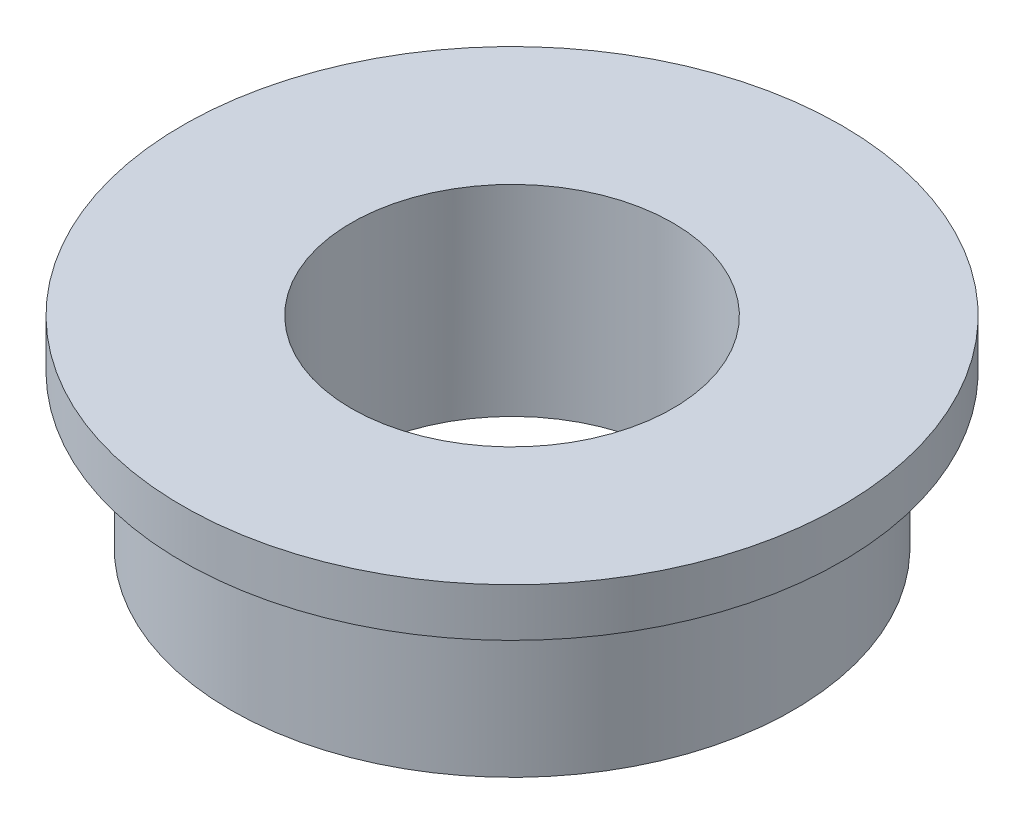
ISO-10303-21;
HEADER;
FILE_DESCRIPTION(('STEP AP214'),'2;1');
FILE_NAME('part.step','',(''),(''),'','','');
FILE_SCHEMA(('AUTOMOTIVE_DESIGN { 1 0 10303 214 1 1 1 1 }'));
ENDSEC;
DATA;
#1=APPLICATION_CONTEXT('core data for automotive mechanical design processes');
#2=APPLICATION_PROTOCOL_DEFINITION('international standard','automotive_design',2000,#1);
#3=PRODUCT_CONTEXT('',#1,'mechanical');
#4=PRODUCT('Part','Part','',(#3));
#5=PRODUCT_RELATED_PRODUCT_CATEGORY('part','',(#4));
#6=PRODUCT_DEFINITION_FORMATION('','',#4);
#7=PRODUCT_DEFINITION_CONTEXT('part definition',#1,'design');
#8=PRODUCT_DEFINITION('design','',#6,#7);
#9=PRODUCT_DEFINITION_SHAPE('','',#8);
#10=(LENGTH_UNIT() NAMED_UNIT(*) SI_UNIT(.MILLI.,.METRE.));
#11=(NAMED_UNIT(*) PLANE_ANGLE_UNIT() SI_UNIT($,.RADIAN.));
#12=(NAMED_UNIT(*) SI_UNIT($,.STERADIAN.) SOLID_ANGLE_UNIT());
#13=UNCERTAINTY_MEASURE_WITH_UNIT(LENGTH_MEASURE(1.E-05),#10,'distance_accuracy_value','');
#14=(GEOMETRIC_REPRESENTATION_CONTEXT(3) GLOBAL_UNCERTAINTY_ASSIGNED_CONTEXT((#13)) GLOBAL_UNIT_ASSIGNED_CONTEXT((#10,
#11,#12)) REPRESENTATION_CONTEXT('',''));
#15=CARTESIAN_POINT('',(0.,0.,0.));
#16=DIRECTION('',(0.,0.,1.));
#17=DIRECTION('',(1.,0.,0.));
#18=AXIS2_PLACEMENT_3D('',#15,#16,#17);
#19=CARTESIAN_POINT('',(0.,0.,0.));
#20=DIRECTION('',(0.,-1.,0.));
#21=DIRECTION('',(0.,0.,-1.));
#22=AXIS2_PLACEMENT_3D('',#19,#20,#21);
#23=PLANE('',#22);
#24=CARTESIAN_POINT('',(0.,0.,0.));
#25=DIRECTION('',(0.,-1.,0.));
#26=DIRECTION('',(0.,0.,-1.));
#27=AXIS2_PLACEMENT_3D('',#24,#25,#26);
#28=CIRCLE('',#27,2.);
#29=CARTESIAN_POINT('',(0.,0.,-2.));
#30=VERTEX_POINT('',#29);
#31=EDGE_CURVE('E64',#30,#30,#28,.T.);
#32=ORIENTED_EDGE('',*,*,#31,.F.);
#33=EDGE_LOOP('',(#32));
#34=FACE_BOUND('',#33,.T.);
#35=CARTESIAN_POINT('',(0.,0.,0.));
#36=DIRECTION('',(0.,-1.,0.));
#37=DIRECTION('',(0.,0.,-1.));
#38=AXIS2_PLACEMENT_3D('',#35,#36,#37);
#39=CIRCLE('',#38,3.5);
#40=CARTESIAN_POINT('',(0.,0.,-3.5));
#41=VERTEX_POINT('',#40);
#42=EDGE_CURVE('E10',#41,#41,#39,.T.);
#43=ORIENTED_EDGE('',*,*,#42,.T.);
#44=EDGE_LOOP('',(#43));
#45=FACE_BOUND('',#44,.T.);
#46=ADVANCED_FACE('F41',(#34,#45),#23,.T.);
#47=CARTESIAN_POINT('',(0.,0.,0.));
#48=DIRECTION('',(0.,-1.,0.));
#49=DIRECTION('',(0.,0.,-1.));
#50=AXIS2_PLACEMENT_3D('',#47,#48,#49);
#51=CYLINDRICAL_SURFACE('',#50,3.5);
#52=CARTESIAN_POINT('',(0.,1.9,0.));
#53=DIRECTION('',(0.,-1.,0.));
#54=DIRECTION('',(0.,0.,-1.));
#55=AXIS2_PLACEMENT_3D('',#52,#53,#54);
#56=CIRCLE('',#55,3.5);
#57=CARTESIAN_POINT('',(0.,1.9,-3.5));
#58=VERTEX_POINT('',#57);
#59=EDGE_CURVE('E48',#58,#58,#56,.T.);
#60=ORIENTED_EDGE('',*,*,#59,.T.);
#61=EDGE_LOOP('',(#60));
#62=FACE_BOUND('',#61,.T.);
#63=ORIENTED_EDGE('',*,*,#42,.F.);
#64=EDGE_LOOP('',(#63));
#65=FACE_BOUND('',#64,.T.);
#66=ADVANCED_FACE('F76',(#62,#65),#51,.T.);
#67=CARTESIAN_POINT('',(3.5,1.9,0.));
#68=DIRECTION('',(0.,-1.,0.));
#69=DIRECTION('',(0.,0.,-1.));
#70=AXIS2_PLACEMENT_3D('',#67,#68,#69);
#71=PLANE('',#70);
#72=CARTESIAN_POINT('',(0.,1.9,0.));
#73=DIRECTION('',(0.,-1.,0.));
#74=DIRECTION('',(0.,0.,-1.));
#75=AXIS2_PLACEMENT_3D('',#72,#73,#74);
#76=CIRCLE('',#75,4.1);
#77=CARTESIAN_POINT('',(0.,1.9,-4.1));
#78=VERTEX_POINT('',#77);
#79=EDGE_CURVE('E53',#78,#78,#76,.T.);
#80=ORIENTED_EDGE('',*,*,#79,.T.);
#81=EDGE_LOOP('',(#80));
#82=FACE_BOUND('',#81,.T.);
#83=ORIENTED_EDGE('',*,*,#59,.F.);
#84=EDGE_LOOP('',(#83));
#85=FACE_BOUND('',#84,.T.);
#86=ADVANCED_FACE('F79',(#82,#85),#71,.T.);
#87=CARTESIAN_POINT('',(0.,0.,0.));
#88=DIRECTION('',(0.,-1.,0.));
#89=DIRECTION('',(0.,0.,-1.));
#90=AXIS2_PLACEMENT_3D('',#87,#88,#89);
#91=CYLINDRICAL_SURFACE('',#90,4.1);
#92=CARTESIAN_POINT('',(0.,2.5,0.));
#93=DIRECTION('',(0.,-1.,0.));
#94=DIRECTION('',(0.,0.,-1.));
#95=AXIS2_PLACEMENT_3D('',#92,#93,#94);
#96=CIRCLE('',#95,4.1);
#97=CARTESIAN_POINT('',(0.,2.5,-4.1));
#98=VERTEX_POINT('',#97);
#99=EDGE_CURVE('E59',#98,#98,#96,.T.);
#100=ORIENTED_EDGE('',*,*,#99,.T.);
#101=EDGE_LOOP('',(#100));
#102=FACE_BOUND('',#101,.T.);
#103=ORIENTED_EDGE('',*,*,#79,.F.);
#104=EDGE_LOOP('',(#103));
#105=FACE_BOUND('',#104,.T.);
#106=ADVANCED_FACE('F82',(#102,#105),#91,.T.);
#107=CARTESIAN_POINT('',(4.1,2.5,0.));
#108=DIRECTION('',(0.,1.,0.));
#109=DIRECTION('',(0.,0.,1.));
#110=AXIS2_PLACEMENT_3D('',#107,#108,#109);
#111=PLANE('',#110);
#112=CARTESIAN_POINT('',(0.,2.5,0.));
#113=DIRECTION('',(0.,1.,0.));
#114=DIRECTION('',(0.,0.,1.));
#115=AXIS2_PLACEMENT_3D('',#112,#113,#114);
#116=CIRCLE('',#115,2.);
#117=CARTESIAN_POINT('',(0.,2.5,2.));
#118=VERTEX_POINT('',#117);
#119=EDGE_CURVE('E65',#118,#118,#116,.F.);
#120=ORIENTED_EDGE('',*,*,#119,.T.);
#121=EDGE_LOOP('',(#120));
#122=FACE_BOUND('',#121,.T.);
#123=ORIENTED_EDGE('',*,*,#99,.F.);
#124=EDGE_LOOP('',(#123));
#125=FACE_BOUND('',#124,.T.);
#126=ADVANCED_FACE('F89',(#122,#125),#111,.T.);
#127=CARTESIAN_POINT('',(0.,2.501,0.));
#128=DIRECTION('',(0.,-1.,0.));
#129=DIRECTION('',(0.,0.,-1.));
#130=AXIS2_PLACEMENT_3D('',#127,#128,#129);
#131=CYLINDRICAL_SURFACE('',#130,2.);
#132=ORIENTED_EDGE('',*,*,#119,.F.);
#133=EDGE_LOOP('',(#132));
#134=FACE_BOUND('',#133,.T.);
#135=ORIENTED_EDGE('',*,*,#31,.T.);
#136=EDGE_LOOP('',(#135));
#137=FACE_BOUND('',#136,.T.);
#138=ADVANCED_FACE('F73',(#134,#137),#131,.F.);
#139=CLOSED_SHELL('',(#46,#66,#86,#106,#126,#138));
#140=MANIFOLD_SOLID_BREP('B2',#139);
#141=ADVANCED_BREP_SHAPE_REPRESENTATION('',(#18,#140),#14);
#142=SHAPE_DEFINITION_REPRESENTATION(#9,#141);
ENDSEC;
END-ISO-10303-21;
